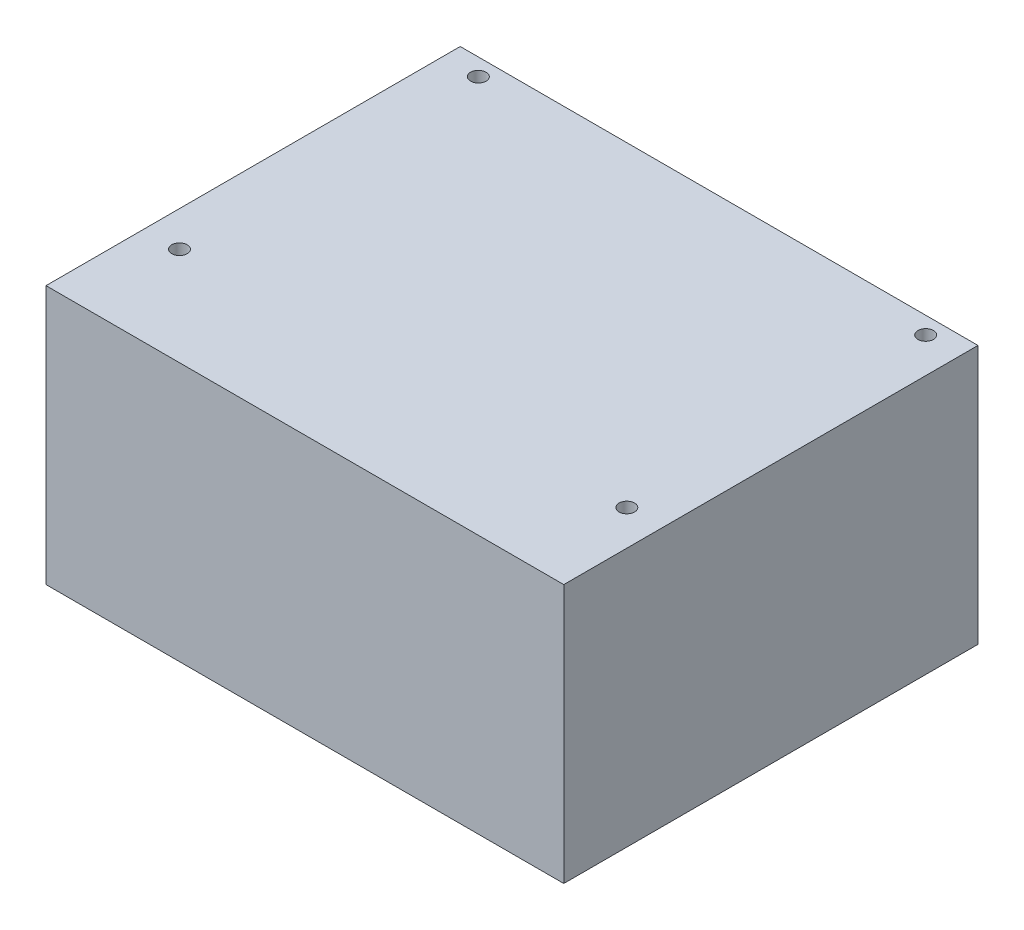
ISO-10303-21;
HEADER;
FILE_DESCRIPTION(('STEP AP214'),'2;1');
FILE_NAME('part.step','',(''),(''),'','','');
FILE_SCHEMA(('AUTOMOTIVE_DESIGN { 1 0 10303 214 1 1 1 1 }'));
ENDSEC;
DATA;
#1=APPLICATION_CONTEXT('core data for automotive mechanical design processes');
#2=APPLICATION_PROTOCOL_DEFINITION('international standard','automotive_design',2000,#1);
#3=PRODUCT_CONTEXT('',#1,'mechanical');
#4=PRODUCT('Part','Part','',(#3));
#5=PRODUCT_RELATED_PRODUCT_CATEGORY('part','',(#4));
#6=PRODUCT_DEFINITION_FORMATION('','',#4);
#7=PRODUCT_DEFINITION_CONTEXT('part definition',#1,'design');
#8=PRODUCT_DEFINITION('design','',#6,#7);
#9=PRODUCT_DEFINITION_SHAPE('','',#8);
#10=(LENGTH_UNIT() NAMED_UNIT(*) SI_UNIT(.MILLI.,.METRE.));
#11=(NAMED_UNIT(*) PLANE_ANGLE_UNIT() SI_UNIT($,.RADIAN.));
#12=(NAMED_UNIT(*) SI_UNIT($,.STERADIAN.) SOLID_ANGLE_UNIT());
#13=UNCERTAINTY_MEASURE_WITH_UNIT(LENGTH_MEASURE(1.E-05),#10,'distance_accuracy_value','');
#14=(GEOMETRIC_REPRESENTATION_CONTEXT(3) GLOBAL_UNCERTAINTY_ASSIGNED_CONTEXT((#13)) GLOBAL_UNIT_ASSIGNED_CONTEXT((#10,
#11,#12)) REPRESENTATION_CONTEXT('',''));
#15=CARTESIAN_POINT('',(0.,0.,0.));
#16=DIRECTION('',(0.,0.,1.));
#17=DIRECTION('',(1.,0.,0.));
#18=AXIS2_PLACEMENT_3D('',#15,#16,#17);
#19=CARTESIAN_POINT('',(50.,50.,-40.));
#20=DIRECTION('',(-1.,0.,0.));
#21=DIRECTION('',(0.,0.,1.));
#22=AXIS2_PLACEMENT_3D('',#19,#20,#21);
#23=PLANE('',#22);
#24=DIRECTION('',(0.,0.,-1.));
#25=VECTOR('',#24,1.);
#26=CARTESIAN_POINT('',(50.,0.,-40.));
#27=LINE('',#26,#25);
#28=CARTESIAN_POINT('',(50.,0.,40.));
#29=VERTEX_POINT('',#28);
#30=CARTESIAN_POINT('',(50.,0.,-40.));
#31=VERTEX_POINT('',#30);
#32=EDGE_CURVE('E95',#29,#31,#27,.T.);
#33=ORIENTED_EDGE('',*,*,#32,.T.);
#34=DIRECTION('',(0.,-1.,0.));
#35=VECTOR('',#34,1.);
#36=CARTESIAN_POINT('',(50.,50.,-40.));
#37=LINE('',#36,#35);
#38=CARTESIAN_POINT('',(50.,50.,-40.));
#39=VERTEX_POINT('',#38);
#40=EDGE_CURVE('E11',#39,#31,#37,.T.);
#41=ORIENTED_EDGE('',*,*,#40,.F.);
#42=DIRECTION('',(0.,0.,-1.));
#43=VECTOR('',#42,1.);
#44=CARTESIAN_POINT('',(50.,50.,-40.));
#45=LINE('',#44,#43);
#46=CARTESIAN_POINT('',(50.,50.,40.));
#47=VERTEX_POINT('',#46);
#48=EDGE_CURVE('E83',#47,#39,#45,.T.);
#49=ORIENTED_EDGE('',*,*,#48,.F.);
#50=DIRECTION('',(0.,-1.,0.));
#51=VECTOR('',#50,1.);
#52=CARTESIAN_POINT('',(50.,50.,40.));
#53=LINE('',#52,#51);
#54=EDGE_CURVE('E91',#47,#29,#53,.T.);
#55=ORIENTED_EDGE('',*,*,#54,.T.);
#56=EDGE_LOOP('',(#33,#41,#49,#55));
#57=FACE_BOUND('',#56,.T.);
#58=ADVANCED_FACE('F32',(#57),#23,.F.);
#59=CARTESIAN_POINT('',(-50.,50.,-40.));
#60=DIRECTION('',(0.,0.,1.));
#61=DIRECTION('',(1.,0.,0.));
#62=AXIS2_PLACEMENT_3D('',#59,#60,#61);
#63=PLANE('',#62);
#64=DIRECTION('',(-1.,0.,0.));
#65=VECTOR('',#64,1.);
#66=CARTESIAN_POINT('',(-50.,0.,-40.));
#67=LINE('',#66,#65);
#68=CARTESIAN_POINT('',(-50.,0.,-40.));
#69=VERTEX_POINT('',#68);
#70=EDGE_CURVE('E87',#31,#69,#67,.T.);
#71=ORIENTED_EDGE('',*,*,#70,.T.);
#72=DIRECTION('',(0.,-1.,0.));
#73=VECTOR('',#72,1.);
#74=CARTESIAN_POINT('',(-50.,50.,-40.));
#75=LINE('',#74,#73);
#76=CARTESIAN_POINT('',(-50.,50.,-40.));
#77=VERTEX_POINT('',#76);
#78=EDGE_CURVE('E40',#77,#69,#75,.T.);
#79=ORIENTED_EDGE('',*,*,#78,.F.);
#80=DIRECTION('',(-1.,0.,0.));
#81=VECTOR('',#80,1.);
#82=CARTESIAN_POINT('',(-50.,50.,-40.));
#83=LINE('',#82,#81);
#84=EDGE_CURVE('E78',#39,#77,#83,.T.);
#85=ORIENTED_EDGE('',*,*,#84,.F.);
#86=ORIENTED_EDGE('',*,*,#40,.T.);
#87=EDGE_LOOP('',(#71,#79,#85,#86));
#88=FACE_BOUND('',#87,.T.);
#89=ADVANCED_FACE('F86',(#88),#63,.F.);
#90=CARTESIAN_POINT('',(-50.,50.,-40.));
#91=DIRECTION('',(1.,0.,0.));
#92=DIRECTION('',(0.,0.,-1.));
#93=AXIS2_PLACEMENT_3D('',#90,#91,#92);
#94=PLANE('',#93);
#95=DIRECTION('',(0.,0.,1.));
#96=VECTOR('',#95,1.);
#97=CARTESIAN_POINT('',(-50.,0.,-40.));
#98=LINE('',#97,#96);
#99=CARTESIAN_POINT('',(-50.,0.,40.));
#100=VERTEX_POINT('',#99);
#101=EDGE_CURVE('E65',#69,#100,#98,.T.);
#102=ORIENTED_EDGE('',*,*,#101,.T.);
#103=DIRECTION('',(0.,-1.,0.));
#104=VECTOR('',#103,1.);
#105=CARTESIAN_POINT('',(-50.,50.,40.));
#106=LINE('',#105,#104);
#107=CARTESIAN_POINT('',(-50.,50.,40.));
#108=VERTEX_POINT('',#107);
#109=EDGE_CURVE('E88',#108,#100,#106,.T.);
#110=ORIENTED_EDGE('',*,*,#109,.F.);
#111=DIRECTION('',(0.,0.,1.));
#112=VECTOR('',#111,1.);
#113=CARTESIAN_POINT('',(-50.,50.,-40.));
#114=LINE('',#113,#112);
#115=EDGE_CURVE('E81',#77,#108,#114,.T.);
#116=ORIENTED_EDGE('',*,*,#115,.F.);
#117=ORIENTED_EDGE('',*,*,#78,.T.);
#118=EDGE_LOOP('',(#102,#110,#116,#117));
#119=FACE_BOUND('',#118,.T.);
#120=ADVANCED_FACE('F89',(#119),#94,.F.);
#121=CARTESIAN_POINT('',(-50.,50.,40.));
#122=DIRECTION('',(0.,0.,-1.));
#123=DIRECTION('',(-1.,0.,0.));
#124=AXIS2_PLACEMENT_3D('',#121,#122,#123);
#125=PLANE('',#124);
#126=DIRECTION('',(1.,0.,0.));
#127=VECTOR('',#126,1.);
#128=CARTESIAN_POINT('',(-50.,0.,40.));
#129=LINE('',#128,#127);
#130=EDGE_CURVE('E71',#100,#29,#129,.T.);
#131=ORIENTED_EDGE('',*,*,#130,.T.);
#132=ORIENTED_EDGE('',*,*,#54,.F.);
#133=DIRECTION('',(1.,0.,0.));
#134=VECTOR('',#133,1.);
#135=CARTESIAN_POINT('',(-50.,50.,40.));
#136=LINE('',#135,#134);
#137=EDGE_CURVE('E48',#108,#47,#136,.T.);
#138=ORIENTED_EDGE('',*,*,#137,.F.);
#139=ORIENTED_EDGE('',*,*,#109,.T.);
#140=EDGE_LOOP('',(#131,#132,#138,#139));
#141=FACE_BOUND('',#140,.T.);
#142=ADVANCED_FACE('F103',(#141),#125,.F.);
#143=CARTESIAN_POINT('',(0.,50.,0.));
#144=DIRECTION('',(0.,1.,0.));
#145=DIRECTION('',(0.,0.,1.));
#146=AXIS2_PLACEMENT_3D('',#143,#144,#145);
#147=PLANE('',#146);
#148=CARTESIAN_POINT('',(-43.2,50.,-36.7));
#149=DIRECTION('',(0.,1.,0.));
#150=DIRECTION('',(0.,0.,-1.));
#151=AXIS2_PLACEMENT_3D('',#148,#149,#150);
#152=CIRCLE('',#151,1.49999999999998);
#153=CARTESIAN_POINT('',(-43.2,50.,-38.2));
#154=VERTEX_POINT('',#153);
#155=EDGE_CURVE('E122',#154,#154,#152,.T.);
#156=ORIENTED_EDGE('',*,*,#155,.F.);
#157=EDGE_LOOP('',(#156));
#158=FACE_BOUND('',#157,.T.);
#159=CARTESIAN_POINT('',(43.2,50.,21.02));
#160=DIRECTION('',(0.,1.,0.));
#161=DIRECTION('',(0.,0.,-1.));
#162=AXIS2_PLACEMENT_3D('',#159,#160,#161);
#163=CIRCLE('',#162,1.49999999999995);
#164=CARTESIAN_POINT('',(43.2,50.,19.52));
#165=VERTEX_POINT('',#164);
#166=EDGE_CURVE('E115',#165,#165,#163,.T.);
#167=ORIENTED_EDGE('',*,*,#166,.F.);
#168=EDGE_LOOP('',(#167));
#169=FACE_BOUND('',#168,.T.);
#170=CARTESIAN_POINT('',(-43.2,50.,21.02));
#171=DIRECTION('',(0.,1.,0.));
#172=DIRECTION('',(0.,0.,1.));
#173=AXIS2_PLACEMENT_3D('',#170,#171,#172);
#174=CIRCLE('',#173,1.49999999999999);
#175=CARTESIAN_POINT('',(-43.2,50.,22.52));
#176=VERTEX_POINT('',#175);
#177=EDGE_CURVE('E127',#176,#176,#174,.T.);
#178=ORIENTED_EDGE('',*,*,#177,.F.);
#179=EDGE_LOOP('',(#178));
#180=FACE_BOUND('',#179,.T.);
#181=CARTESIAN_POINT('',(43.2,50.,-36.7));
#182=DIRECTION('',(0.,1.,0.));
#183=DIRECTION('',(0.,0.,1.));
#184=AXIS2_PLACEMENT_3D('',#181,#182,#183);
#185=CIRCLE('',#184,1.5);
#186=CARTESIAN_POINT('',(43.2,50.,-35.2));
#187=VERTEX_POINT('',#186);
#188=EDGE_CURVE('E109',#187,#187,#185,.T.);
#189=ORIENTED_EDGE('',*,*,#188,.F.);
#190=EDGE_LOOP('',(#189));
#191=FACE_BOUND('',#190,.T.);
#192=ORIENTED_EDGE('',*,*,#48,.T.);
#193=ORIENTED_EDGE('',*,*,#84,.T.);
#194=ORIENTED_EDGE('',*,*,#115,.T.);
#195=ORIENTED_EDGE('',*,*,#137,.T.);
#196=EDGE_LOOP('',(#192,#193,#194,#195));
#197=FACE_BOUND('',#196,.T.);
#198=ADVANCED_FACE('F79',(#158,#169,#180,#191,#197),#147,.T.);
#199=CARTESIAN_POINT('',(0.,0.,0.));
#200=DIRECTION('',(0.,1.,0.));
#201=DIRECTION('',(0.,0.,1.));
#202=AXIS2_PLACEMENT_3D('',#199,#200,#201);
#203=PLANE('',#202);
#204=CARTESIAN_POINT('',(-43.2,0.,-36.7));
#205=DIRECTION('',(0.,1.,0.));
#206=DIRECTION('',(0.,0.,-1.));
#207=AXIS2_PLACEMENT_3D('',#204,#205,#206);
#208=CIRCLE('',#207,1.49999999999998);
#209=CARTESIAN_POINT('',(-43.2,0.,-38.2));
#210=VERTEX_POINT('',#209);
#211=EDGE_CURVE('E112',#210,#210,#208,.T.);
#212=ORIENTED_EDGE('',*,*,#211,.T.);
#213=EDGE_LOOP('',(#212));
#214=FACE_BOUND('',#213,.T.);
#215=CARTESIAN_POINT('',(43.2,0.,21.02));
#216=DIRECTION('',(0.,1.,0.));
#217=DIRECTION('',(0.,0.,-1.));
#218=AXIS2_PLACEMENT_3D('',#215,#216,#217);
#219=CIRCLE('',#218,1.49999999999995);
#220=CARTESIAN_POINT('',(43.2,0.,19.52));
#221=VERTEX_POINT('',#220);
#222=EDGE_CURVE('E118',#221,#221,#219,.T.);
#223=ORIENTED_EDGE('',*,*,#222,.T.);
#224=EDGE_LOOP('',(#223));
#225=FACE_BOUND('',#224,.T.);
#226=CARTESIAN_POINT('',(-43.2,0.,21.02));
#227=DIRECTION('',(0.,1.,0.));
#228=DIRECTION('',(0.,0.,1.));
#229=AXIS2_PLACEMENT_3D('',#226,#227,#228);
#230=CIRCLE('',#229,1.49999999999999);
#231=CARTESIAN_POINT('',(-43.2,0.,22.52));
#232=VERTEX_POINT('',#231);
#233=EDGE_CURVE('E119',#232,#232,#230,.T.);
#234=ORIENTED_EDGE('',*,*,#233,.T.);
#235=EDGE_LOOP('',(#234));
#236=FACE_BOUND('',#235,.T.);
#237=CARTESIAN_POINT('',(43.2,0.,-36.7));
#238=DIRECTION('',(0.,1.,0.));
#239=DIRECTION('',(0.,0.,1.));
#240=AXIS2_PLACEMENT_3D('',#237,#238,#239);
#241=CIRCLE('',#240,1.5);
#242=CARTESIAN_POINT('',(43.2,0.,-35.2));
#243=VERTEX_POINT('',#242);
#244=EDGE_CURVE('E98',#243,#243,#241,.T.);
#245=ORIENTED_EDGE('',*,*,#244,.T.);
#246=EDGE_LOOP('',(#245));
#247=FACE_BOUND('',#246,.T.);
#248=ORIENTED_EDGE('',*,*,#32,.F.);
#249=ORIENTED_EDGE('',*,*,#130,.F.);
#250=ORIENTED_EDGE('',*,*,#101,.F.);
#251=ORIENTED_EDGE('',*,*,#70,.F.);
#252=EDGE_LOOP('',(#248,#249,#250,#251));
#253=FACE_BOUND('',#252,.T.);
#254=ADVANCED_FACE('F106',(#214,#225,#236,#247,#253),#203,.F.);
#255=CARTESIAN_POINT('',(43.2,0.,-36.7));
#256=DIRECTION('',(0.,1.,0.));
#257=DIRECTION('',(0.,0.,1.));
#258=AXIS2_PLACEMENT_3D('',#255,#256,#257);
#259=CYLINDRICAL_SURFACE('',#258,1.5);
#260=ORIENTED_EDGE('',*,*,#244,.F.);
#261=EDGE_LOOP('',(#260));
#262=FACE_BOUND('',#261,.T.);
#263=ORIENTED_EDGE('',*,*,#188,.T.);
#264=EDGE_LOOP('',(#263));
#265=FACE_BOUND('',#264,.T.);
#266=ADVANCED_FACE('F139',(#262,#265),#259,.F.);
#267=CARTESIAN_POINT('',(-43.2,0.,21.02));
#268=DIRECTION('',(0.,1.,0.));
#269=DIRECTION('',(0.,0.,1.));
#270=AXIS2_PLACEMENT_3D('',#267,#268,#269);
#271=CYLINDRICAL_SURFACE('',#270,1.49999999999999);
#272=ORIENTED_EDGE('',*,*,#233,.F.);
#273=EDGE_LOOP('',(#272));
#274=FACE_BOUND('',#273,.T.);
#275=ORIENTED_EDGE('',*,*,#177,.T.);
#276=EDGE_LOOP('',(#275));
#277=FACE_BOUND('',#276,.T.);
#278=ADVANCED_FACE('F135',(#274,#277),#271,.F.);
#279=CARTESIAN_POINT('',(43.2,0.,21.02));
#280=DIRECTION('',(0.,1.,0.));
#281=DIRECTION('',(0.,0.,1.));
#282=AXIS2_PLACEMENT_3D('',#279,#280,#281);
#283=CYLINDRICAL_SURFACE('',#282,1.49999999999995);
#284=ORIENTED_EDGE('',*,*,#222,.F.);
#285=EDGE_LOOP('',(#284));
#286=FACE_BOUND('',#285,.T.);
#287=ORIENTED_EDGE('',*,*,#166,.T.);
#288=EDGE_LOOP('',(#287));
#289=FACE_BOUND('',#288,.T.);
#290=ADVANCED_FACE('F138',(#286,#289),#283,.F.);
#291=CARTESIAN_POINT('',(-43.2,0.,-36.7));
#292=DIRECTION('',(0.,1.,0.));
#293=DIRECTION('',(0.,0.,1.));
#294=AXIS2_PLACEMENT_3D('',#291,#292,#293);
#295=CYLINDRICAL_SURFACE('',#294,1.49999999999998);
#296=ORIENTED_EDGE('',*,*,#211,.F.);
#297=EDGE_LOOP('',(#296));
#298=FACE_BOUND('',#297,.T.);
#299=ORIENTED_EDGE('',*,*,#155,.T.);
#300=EDGE_LOOP('',(#299));
#301=FACE_BOUND('',#300,.T.);
#302=ADVANCED_FACE('F200',(#298,#301),#295,.F.);
#303=CLOSED_SHELL('',(#58,#89,#120,#142,#198,#254,#266,#278,#290,#302));
#304=MANIFOLD_SOLID_BREP('B2',#303);
#305=ADVANCED_BREP_SHAPE_REPRESENTATION('',(#18,#304),#14);
#306=SHAPE_DEFINITION_REPRESENTATION(#9,#305);
ENDSEC;
END-ISO-10303-21;
